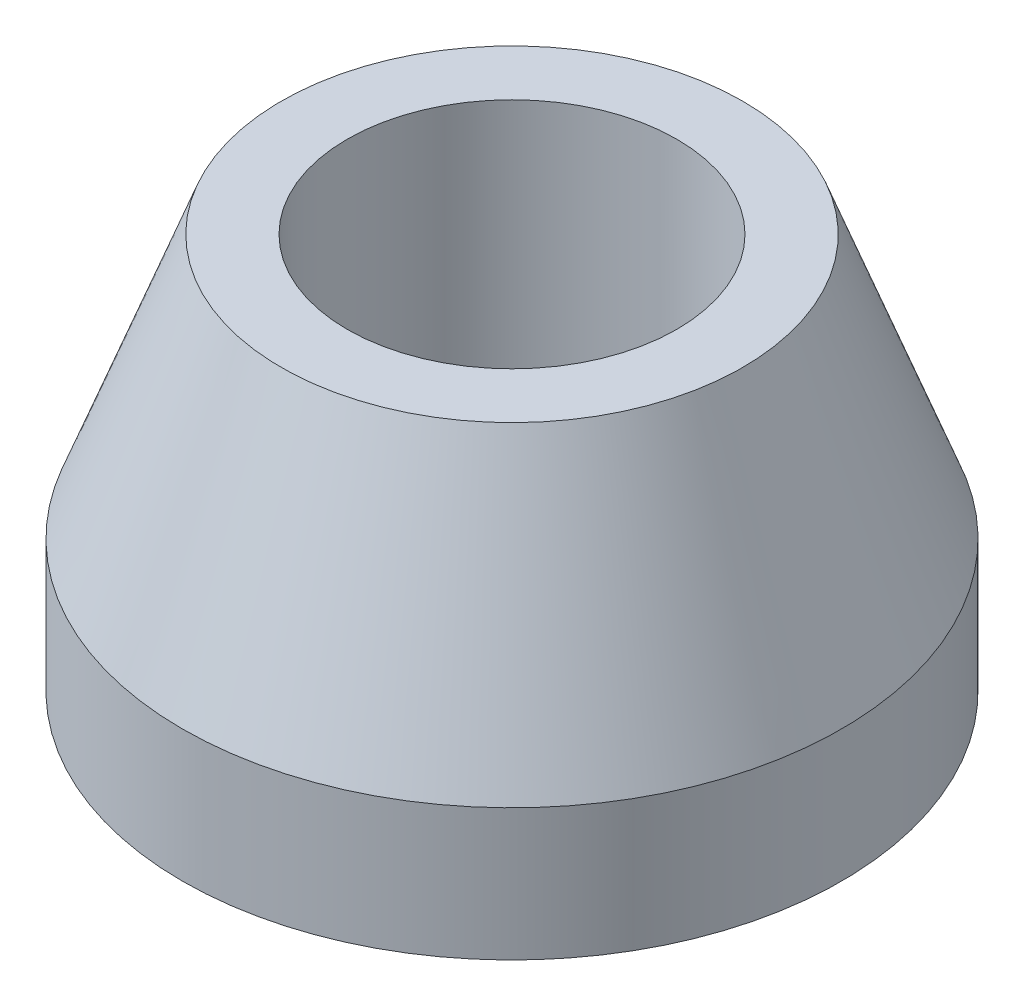
ISO-10303-21;
HEADER;
FILE_DESCRIPTION(('STEP AP214'),'2;1');
FILE_NAME('part.step','',(''),(''),'','','');
FILE_SCHEMA(('AUTOMOTIVE_DESIGN { 1 0 10303 214 1 1 1 1 }'));
ENDSEC;
DATA;
#1=APPLICATION_CONTEXT('core data for automotive mechanical design processes');
#2=APPLICATION_PROTOCOL_DEFINITION('international standard','automotive_design',2000,#1);
#3=PRODUCT_CONTEXT('',#1,'mechanical');
#4=PRODUCT('Part','Part','',(#3));
#5=PRODUCT_RELATED_PRODUCT_CATEGORY('part','',(#4));
#6=PRODUCT_DEFINITION_FORMATION('','',#4);
#7=PRODUCT_DEFINITION_CONTEXT('part definition',#1,'design');
#8=PRODUCT_DEFINITION('design','',#6,#7);
#9=PRODUCT_DEFINITION_SHAPE('','',#8);
#10=(LENGTH_UNIT() NAMED_UNIT(*) SI_UNIT(.MILLI.,.METRE.));
#11=(NAMED_UNIT(*) PLANE_ANGLE_UNIT() SI_UNIT($,.RADIAN.));
#12=(NAMED_UNIT(*) SI_UNIT($,.STERADIAN.) SOLID_ANGLE_UNIT());
#13=UNCERTAINTY_MEASURE_WITH_UNIT(LENGTH_MEASURE(1.E-05),#10,'distance_accuracy_value','');
#14=(GEOMETRIC_REPRESENTATION_CONTEXT(3) GLOBAL_UNCERTAINTY_ASSIGNED_CONTEXT((#13)) GLOBAL_UNIT_ASSIGNED_CONTEXT((#10,
#11,#12)) REPRESENTATION_CONTEXT('',''));
#15=CARTESIAN_POINT('',(0.,0.,0.));
#16=DIRECTION('',(0.,0.,1.));
#17=DIRECTION('',(1.,0.,0.));
#18=AXIS2_PLACEMENT_3D('',#15,#16,#17);
#19=CARTESIAN_POINT('',(0.,0.,0.));
#20=DIRECTION('',(0.,-1.,0.));
#21=DIRECTION('',(0.,0.,-1.));
#22=AXIS2_PLACEMENT_3D('',#19,#20,#21);
#23=CYLINDRICAL_SURFACE('',#22,25.);
#24=CARTESIAN_POINT('',(0.,15.,-25.));
#25=CARTESIAN_POINT('',(-0.138987493787324,15.0000027694463,-25.0000014065203));
#26=CARTESIAN_POINT('',(-0.277940302046088,14.9942032492811,-24.9988389427216));
#27=CARTESIAN_POINT('',(-0.554886864496204,14.9710563512974,-24.994224565157));
#28=CARTESIAN_POINT('',(-0.692880432791919,14.9537067948975,-24.9907722194715));
#29=CARTESIAN_POINT('',(-0.966937148503881,14.9075814377122,-24.981670242636));
#30=CARTESIAN_POINT('',(-1.10299928122357,14.8787998455141,-24.9760194978176));
#31=CARTESIAN_POINT('',(-1.37221108352448,14.810025349109,-24.9626762565998));
#32=CARTESIAN_POINT('',(-1.50535966309261,14.7700283237777,-24.9549830097359));
#33=CARTESIAN_POINT('',(-1.76758319373794,14.6791962522582,-24.9377804442932));
#34=CARTESIAN_POINT('',(-1.896663374225,14.6283758297848,-24.9282735779222));
#35=CARTESIAN_POINT('',(-2.15009997814349,14.5162240178123,-24.9076944208426));
#36=CARTESIAN_POINT('',(-2.2744546389337,14.4548887523412,-24.8966215531404));
#37=CARTESIAN_POINT('',(-2.51749782000809,14.3221945692906,-24.8732206370355));
#38=CARTESIAN_POINT('',(-2.63618884664851,14.2508401417061,-24.8608931515555));
#39=CARTESIAN_POINT('',(-2.86722020463685,14.0985603647523,-24.8353088041128));
#40=CARTESIAN_POINT('',(-2.97955814193969,14.0176314424647,-24.8220515959613));
#41=CARTESIAN_POINT('',(-3.1983785388143,13.8457711931702,-24.7948114657324));
#42=CARTESIAN_POINT('',(-3.30477652475172,13.7547333566458,-24.780821838943));
#43=CARTESIAN_POINT('',(-3.50958996762926,13.5640376679645,-24.7526457290753));
#44=CARTESIAN_POINT('',(-3.60800245195942,13.4643766340819,-24.738459174971));
#45=CARTESIAN_POINT('',(-3.79610927604841,13.2571655640739,-24.7102933832022));
#46=CARTESIAN_POINT('',(-3.88580612172819,13.1496178112366,-24.6963140869323));
#47=CARTESIAN_POINT('',(-4.05592901668139,12.9272928345424,-24.6689453876666));
#48=CARTESIAN_POINT('',(-4.13635163435981,12.8125129588355,-24.6555562041458));
#49=CARTESIAN_POINT('',(-4.28798741229219,12.5754841568505,-24.6296394657581));
#50=CARTESIAN_POINT('',(-4.35911381454495,12.4531786550123,-24.6171204770982));
#51=CARTESIAN_POINT('',(-4.49081269831453,12.2028712528765,-24.5934353082732));
#52=CARTESIAN_POINT('',(-4.55138122040544,12.0748672380124,-24.5822696361062));
#53=CARTESIAN_POINT('',(-4.71644727257975,11.6837416438572,-24.5513304070068));
#54=CARTESIAN_POINT('',(-4.8044888260482,11.4132193246056,-24.5340820165952));
#55=CARTESIAN_POINT('',(-4.93264780265691,10.8645385652061,-24.508635793463));
#56=CARTESIAN_POINT('',(-4.97337819482265,10.5865266702931,-24.5003223072134));
#57=CARTESIAN_POINT('',(-5.00775493418216,10.027461501124,-24.4933199482487));
#58=CARTESIAN_POINT('',(-5.00140609582258,9.74640854079041,-24.4946300913956));
#59=CARTESIAN_POINT('',(-4.94227436036826,9.19376328007145,-24.5066272442008));
#60=CARTESIAN_POINT('',(-4.89019310186595,8.92209222682575,-24.5171725589932));
#61=CARTESIAN_POINT('',(-4.7421890224497,8.39142036175825,-24.546227391949));
#62=CARTESIAN_POINT('',(-4.64626410780486,8.13242015568011,-24.5647372904543));
#63=CARTESIAN_POINT('',(-4.41262402680007,7.63242348985321,-24.6077809023025));
#64=CARTESIAN_POINT('',(-4.27463078523214,7.39156054809247,-24.632354484594));
#65=CARTESIAN_POINT('',(-3.96096784378848,6.93614580420382,-24.684730944745));
#66=CARTESIAN_POINT('',(-3.78529381392922,6.72159703035303,-24.7125341935642));
#67=CARTESIAN_POINT('',(-3.39749968079915,6.32085297284371,-24.7688510603976));
#68=CARTESIAN_POINT('',(-3.18478080820446,6.13523715671345,-24.797368460096));
#69=CARTESIAN_POINT('',(-2.73092511816779,5.80223077248482,-24.8514424361697));
#70=CARTESIAN_POINT('',(-2.48978793632426,5.654840694624,-24.8769989745701));
#71=CARTESIAN_POINT('',(-1.98529693496818,5.40236245277653,-24.9223345079227));
#72=CARTESIAN_POINT('',(-1.72190909807365,5.29734053140293,-24.9421044423773));
#73=CARTESIAN_POINT('',(-1.1807448820962,5.13319763018151,-24.9735704494292));
#74=CARTESIAN_POINT('',(-0.902970250347201,5.07407109003581,-24.98526750005));
#75=CARTESIAN_POINT('',(-0.345897028150551,5.00421773063142,-24.9991335933204));
#76=CARTESIAN_POINT('',(-0.0667016415443251,4.9926979010851,-25.0014587325673));
#77=CARTESIAN_POINT('',(0.489624670880015,5.01624929592439,-24.9967525965614));
#78=CARTESIAN_POINT('',(0.766755711869965,5.05131790121963,-24.9897218472742));
#79=CARTESIAN_POINT('',(1.30852830007856,5.1663918633032,-24.9671916002008));
#80=CARTESIAN_POINT('',(1.57325974299468,5.24599032609437,-24.9517688194687));
#81=CARTESIAN_POINT('',(2.08561813620307,5.44741992967542,-24.9141776037933));
#82=CARTESIAN_POINT('',(2.33324380335236,5.56925423455486,-24.892008663478));
#83=CARTESIAN_POINT('',(2.80770587332562,5.85341239133697,-24.8429955738642));
#84=CARTESIAN_POINT('',(3.03425065213174,6.01621367280056,-24.8160975113418));
#85=CARTESIAN_POINT('',(3.45709007722326,6.3770461884555,-24.760736752006));
#86=CARTESIAN_POINT('',(3.65338147605435,6.57508119979268,-24.7322738876682));
#87=CARTESIAN_POINT('',(4.01320302351496,7.0043658784477,-24.6764651380018));
#88=CARTESIAN_POINT('',(4.17618877400404,7.23607540979487,-24.6491428619003));
#89=CARTESIAN_POINT('',(4.46092683850573,7.7240601179627,-24.5992097395686));
#90=CARTESIAN_POINT('',(4.58268080227279,7.98033431138257,-24.5765987048474));
#91=CARTESIAN_POINT('',(4.78076018011429,8.50882893225384,-24.5388364729789));
#92=CARTESIAN_POINT('',(4.85732111853824,8.78095841785706,-24.5236466726876));
#93=CARTESIAN_POINT('',(4.96353963899985,9.33471304958447,-24.5023739077135));
#94=CARTESIAN_POINT('',(4.9932033375265,9.61633695252213,-24.4962897554484));
#95=CARTESIAN_POINT('',(5.00179339144585,10.0366703889551,-24.4945288792509));
#96=CARTESIAN_POINT('',(4.99885021968412,10.1752265681492,-24.4951330184965));
#97=CARTESIAN_POINT('',(4.98148651470878,10.4515737957145,-24.4986714739674));
#98=CARTESIAN_POINT('',(4.9670703371849,10.5893651144752,-24.5016049058833));
#99=CARTESIAN_POINT('',(4.92686276339316,10.8632490159191,-24.5097212135577));
#100=CARTESIAN_POINT('',(4.90106738632089,10.9993409869687,-24.5149048765081));
#101=CARTESIAN_POINT('',(4.83831799577184,11.2687799057397,-24.5273664043086));
#102=CARTESIAN_POINT('',(4.80136796328246,11.4021278146839,-24.5346435219816));
#103=CARTESIAN_POINT('',(4.71667811844351,11.6649227005665,-24.5510651803018));
#104=CARTESIAN_POINT('',(4.66896100938054,11.7943772453011,-24.5602057877658));
#105=CARTESIAN_POINT('',(4.56306801677477,12.0487516964052,-24.5800998692381));
#106=CARTESIAN_POINT('',(4.5048958336854,12.1736731884551,-24.5908527723703));
#107=CARTESIAN_POINT('',(4.37847423732261,12.4182475627271,-24.6136768592635));
#108=CARTESIAN_POINT('',(4.31022064232977,12.537898231772,-24.6257485895239));
#109=CARTESIAN_POINT('',(4.1641570153785,12.7710492454946,-24.6508678052533));
#110=CARTESIAN_POINT('',(4.08635026305034,12.8845516817026,-24.6639149552593));
#111=CARTESIAN_POINT('',(3.92025868558202,13.1066267352987,-24.6908640955351));
#112=CARTESIAN_POINT('',(3.83181538764857,13.2150795397072,-24.7047769949563));
#113=CARTESIAN_POINT('',(3.64620484015059,13.424138296357,-24.7328525343466));
#114=CARTESIAN_POINT('',(3.54904066604526,13.5247469916541,-24.7470150848702));
#115=CARTESIAN_POINT('',(3.34655721556743,13.717540620803,-24.7752095204235));
#116=CARTESIAN_POINT('',(3.24123314471885,13.8097205317761,-24.7892413231228));
#117=CARTESIAN_POINT('',(3.02322778921367,13.9849269400267,-24.8167717117019));
#118=CARTESIAN_POINT('',(2.91054922625043,14.067956793247,-24.8302704919035));
#119=CARTESIAN_POINT('',(2.67729343786965,14.2251738971151,-24.8565085935593));
#120=CARTESIAN_POINT('',(2.55664367436167,14.2992552310598,-24.869238066002));
#121=CARTESIAN_POINT('',(2.30944481023434,14.4369443352167,-24.8934104051449));
#122=CARTESIAN_POINT('',(2.18289789785573,14.5005559513136,-24.9048537437938));
#123=CARTESIAN_POINT('',(1.92482332637311,14.6168245035003,-24.9261268452451));
#124=CARTESIAN_POINT('',(1.79329873940675,14.6694880703005,-24.9359575839567));
#125=CARTESIAN_POINT('',(1.52618442476761,14.763487680713,-24.9537310452209));
#126=CARTESIAN_POINT('',(1.39059548585458,14.8048259066209,-24.9616741314688));
#127=CARTESIAN_POINT('',(1.04920215690347,14.8932231271974,-24.9788087281562));
#128=CARTESIAN_POINT('',(0.841457494405879,14.9332098107155,-24.9867141903289));
#129=CARTESIAN_POINT('',(0.422448453280691,14.9865957194188,-24.9973086745575));
#130=CARTESIAN_POINT('',(0.211184187046265,14.9999957919719,-24.9999978628663));
#131=CARTESIAN_POINT('',(0.,15.,-25.));
#132=B_SPLINE_CURVE_WITH_KNOTS('',3,(#24,#25,#26,#27,#28,#29,#30,#31,#32,#33,#34,#35,#36,#37,
#38,#39,#40,#41,#42,#43,#44,#45,#46,#47,#48,#49,#50,#51,#52,#53,#54,#55,#56,#57,#58,#59,#60,#61,
#62,#63,#64,#65,#66,#67,#68,#69,#70,#71,#72,#73,#74,#75,#76,#77,#78,#79,#80,#81,#82,#83,#84,#85,
#86,#87,#88,#89,#90,#91,#92,#93,#94,#95,#96,#97,#98,#99,#100,#101,#102,#103,#104,#105,#106,#107,
#108,#109,#110,#111,#112,#113,#114,#115,#116,#117,#118,#119,#120,#121,#122,#123,#124,#125,#126,
#127,#128,#129,#130,#131),.UNSPECIFIED.,.T.,.F.,(4,2,2,2,2,2,2,2,2,2,2,2,2,2,2,2,2,2,2,2,2,2,2,
2,2,2,2,2,2,2,2,2,2,2,2,2,2,2,2,2,2,2,2,2,2,2,2,2,2,2,2,2,2,4),(0.,0.416777047445418,
0.833632730149863,1.25069985977206,1.66792044248879,2.0845808461562,2.50139517036217,
2.91802329572164,3.33480738770838,3.7564966440872,4.17834216132243,4.60006602836891,
5.02194544187045,5.44751701120412,5.87324783701269,6.72369555497643,7.56299734191929,
8.40221330082507,9.22877443707773,10.0553750494503,10.8875625969434,11.7198458242473,
12.5671007113313,13.4143664637548,14.262951829465,15.1114343716656,15.9457248705771,
16.7799684696572,17.6067107843,18.4335150475649,19.2704413884317,20.1074575040603,
20.9572195157251,21.8069475229371,22.6522071384191,23.4973565033242,23.9127168808878,
24.3279196434016,24.7432677723233,25.1584678424529,25.5728004765726,25.9869867501795,
26.4013453111814,26.8155620171985,27.2369706991647,27.6582313488923,28.0797414220244,
28.5010963808509,28.9270309561325,29.3528087202144,29.7783278548953,30.203764937947,
30.8370559265658,31.4703267306209),.UNSPECIFIED.);
#133=CARTESIAN_POINT('',(0.,15.,-25.));
#134=VERTEX_POINT('',#133);
#135=EDGE_CURVE('E61',#134,#134,#132,.T.);
#136=ORIENTED_EDGE('',*,*,#135,.F.);
#137=EDGE_LOOP('',(#136));
#138=FACE_BOUND('',#137,.T.);
#139=CARTESIAN_POINT('',(0.,0.,0.));
#140=DIRECTION('',(0.,-1.,0.));
#141=DIRECTION('',(0.,0.,-1.));
#142=AXIS2_PLACEMENT_3D('',#139,#140,#141);
#143=CIRCLE('',#142,25.);
#144=CARTESIAN_POINT('',(0.,0.,-25.));
#145=VERTEX_POINT('',#144);
#146=EDGE_CURVE('E42',#145,#145,#143,.T.);
#147=ORIENTED_EDGE('',*,*,#146,.T.);
#148=EDGE_LOOP('',(#147));
#149=FACE_BOUND('',#148,.T.);
#150=CARTESIAN_POINT('',(0.,60.,0.));
#151=DIRECTION('',(0.,-1.,0.));
#152=DIRECTION('',(0.,0.,-1.));
#153=AXIS2_PLACEMENT_3D('',#150,#151,#152);
#154=CIRCLE('',#153,25.);
#155=CARTESIAN_POINT('',(0.,60.,-25.));
#156=VERTEX_POINT('',#155);
#157=EDGE_CURVE('E58',#156,#156,#154,.T.);
#158=ORIENTED_EDGE('',*,*,#157,.F.);
#159=EDGE_LOOP('',(#158));
#160=FACE_BOUND('',#159,.T.);
#161=ADVANCED_FACE('F31',(#138,#149,#160),#23,.F.);
#162=CARTESIAN_POINT('',(25.,0.,0.));
#163=DIRECTION('',(0.,-1.,0.));
#164=DIRECTION('',(0.,0.,-1.));
#165=AXIS2_PLACEMENT_3D('',#162,#163,#164);
#166=PLANE('',#165);
#167=CARTESIAN_POINT('',(0.,0.,0.));
#168=DIRECTION('',(0.,-1.,0.));
#169=DIRECTION('',(0.,0.,-1.));
#170=AXIS2_PLACEMENT_3D('',#167,#168,#169);
#171=CIRCLE('',#170,50.);
#172=CARTESIAN_POINT('',(0.,0.,-50.));
#173=VERTEX_POINT('',#172);
#174=EDGE_CURVE('E46',#173,#173,#171,.T.);
#175=ORIENTED_EDGE('',*,*,#174,.T.);
#176=EDGE_LOOP('',(#175));
#177=FACE_BOUND('',#176,.T.);
#178=ORIENTED_EDGE('',*,*,#146,.F.);
#179=EDGE_LOOP('',(#178));
#180=FACE_BOUND('',#179,.T.);
#181=ADVANCED_FACE('F81',(#177,#180),#166,.T.);
#182=CARTESIAN_POINT('',(0.,0.,0.));
#183=DIRECTION('',(0.,-1.,0.));
#184=DIRECTION('',(0.,0.,-1.));
#185=AXIS2_PLACEMENT_3D('',#182,#183,#184);
#186=CYLINDRICAL_SURFACE('',#185,50.);
#187=CARTESIAN_POINT('',(0.,15.,-50.));
#188=CARTESIAN_POINT('',(0.140100461033938,15.0000013777548,-50.0000003743881));
#189=CARTESIAN_POINT('',(0.280179892133932,14.9941093369416,-49.9994099664565));
#190=CARTESIAN_POINT('',(0.559384605481633,14.9705849108721,-49.9970656286844));
#191=CARTESIAN_POINT('',(0.698509650807407,14.9529497099087,-49.9953114197949));
#192=CARTESIAN_POINT('',(0.974876810291467,14.9060450546854,-49.990686488879));
#193=CARTESIAN_POINT('',(1.11211733275272,14.8767663246402,-49.9878148767159));
#194=CARTESIAN_POINT('',(1.38367953746195,14.806776311435,-49.9810352616415));
#195=CARTESIAN_POINT('',(1.51800013207783,14.7660608442832,-49.9771268794695));
#196=CARTESIAN_POINT('',(1.78258815793808,14.673542799818,-49.968388862618));
#197=CARTESIAN_POINT('',(1.9128594168042,14.6217510813806,-49.9635601307267));
#198=CARTESIAN_POINT('',(2.16861600653063,14.5074087031425,-49.9531129442553));
#199=CARTESIAN_POINT('',(2.29409955432331,14.4448540818326,-49.9474941990341));
#200=CARTESIAN_POINT('',(2.53927920710544,14.3094848283795,-49.9356297496778));
#201=CARTESIAN_POINT('',(2.65897858413043,14.2366760903252,-49.9293844063018));
#202=CARTESIAN_POINT('',(2.89187409366608,14.0812584220491,-49.9164369111371));
#203=CARTESIAN_POINT('',(3.00506780046608,13.9986458711058,-49.90973459097));
#204=CARTESIAN_POINT('',(3.22442516584175,13.8239762941015,-49.8960438865044));
#205=CARTESIAN_POINT('',(3.33056800916345,13.7318931858257,-49.8890547458808));
#206=CARTESIAN_POINT('',(3.53476522468386,13.5390902133424,-49.8750029081307));
#207=CARTESIAN_POINT('',(3.6328165925971,13.4383671692677,-49.8679401847701));
#208=CARTESIAN_POINT('',(3.82006793418719,13.22905453875,-49.853945639318));
#209=CARTESIAN_POINT('',(3.90927074723064,13.1204674952211,-49.8470137758174));
#210=CARTESIAN_POINT('',(4.07826305039188,12.8961182338074,-49.8334722976176));
#211=CARTESIAN_POINT('',(4.15804905479459,12.7803533830289,-49.8268628027738));
#212=CARTESIAN_POINT('',(4.30773494085765,12.5422870703204,-49.8141453282559));
#213=CARTESIAN_POINT('',(4.37761719102717,12.4199744717299,-49.8080382509359));
#214=CARTESIAN_POINT('',(4.50685113325592,12.1698210139221,-49.796510955401));
#215=CARTESIAN_POINT('',(4.56619891513861,12.0419781237819,-49.7910909924413));
#216=CARTESIAN_POINT('',(4.67388203969832,11.781750940842,-49.7810984182545));
#217=CARTESIAN_POINT('',(4.72222165895323,11.6493684347209,-49.7765254780955));
#218=CARTESIAN_POINT('',(4.80757979958036,11.3809589711489,-49.7683532658288));
#219=CARTESIAN_POINT('',(4.84459415265808,11.2449306918469,-49.7647543522704));
#220=CARTESIAN_POINT('',(4.93794230581997,10.8338494730534,-49.7556112743006));
#221=CARTESIAN_POINT('',(4.97706409180383,10.5546295739826,-49.7516744142284));
#222=CARTESIAN_POINT('',(5.00789059851941,9.99371322589344,-49.7485802587524));
#223=CARTESIAN_POINT('',(4.9995965655709,9.71201684216349,-49.7494228377215));
#224=CARTESIAN_POINT('',(4.93601762379308,9.15503476757941,-49.7557708498252));
#225=CARTESIAN_POINT('',(4.88090320838524,8.8797295356838,-49.7612593648233));
#226=CARTESIAN_POINT('',(4.72549673300413,8.34230715162628,-49.7762565790783));
#227=CARTESIAN_POINT('',(4.62520406273851,8.08019017767169,-49.7857653326426));
#228=CARTESIAN_POINT('',(4.3821041974626,7.57603287816206,-49.8077505089504));
#229=CARTESIAN_POINT('',(4.23922134072076,7.33402927087453,-49.8202322051485));
#230=CARTESIAN_POINT('',(3.91505020964741,6.87737370711309,-49.846752576903));
#231=CARTESIAN_POINT('',(3.73376081125102,6.6627225514726,-49.8607912980239));
#232=CARTESIAN_POINT('',(3.33697054240559,6.26587308893184,-49.8889192682764));
#233=CARTESIAN_POINT('',(3.12132238898974,6.08382200636641,-49.9030084673536));
#234=CARTESIAN_POINT('',(2.66244741395265,5.7584818196776,-49.9295914532222));
#235=CARTESIAN_POINT('',(2.41922056141156,5.61519275901287,-49.9420852382248));
#236=CARTESIAN_POINT('',(1.91199052704802,5.37144990265422,-49.9640737835429));
#237=CARTESIAN_POINT('',(1.64798373156272,5.27100357695714,-49.9735680207869));
#238=CARTESIAN_POINT('',(1.10673608703644,5.11590541539382,-49.988482372022));
#239=CARTESIAN_POINT('',(0.829495634016396,5.0612522100625,-49.9939026078476));
#240=CARTESIAN_POINT('',(0.270925495326696,4.99947846131062,-50.0000425834211));
#241=CARTESIAN_POINT('',(-0.0103815106741396,4.992154757637,-50.000782413361));
#242=CARTESIAN_POINT('',(-0.570218966431821,5.02471431634431,-49.9975320878656));
#243=CARTESIAN_POINT('',(-0.848749453648462,5.06459694096279,-49.993541996332));
#244=CARTESIAN_POINT('',(-1.39454103462632,5.19026847273057,-49.9812930768513));
#245=CARTESIAN_POINT('',(-1.66182424652395,5.27596225599486,-49.9730430954945));
#246=CARTESIAN_POINT('',(-2.17822160525502,5.49072588658192,-49.953199943438));
#247=CARTESIAN_POINT('',(-2.42733534458293,5.61979670640248,-49.9416066977843));
#248=CARTESIAN_POINT('',(-2.90124090708419,5.91815413190872,-49.9163237649944));
#249=CARTESIAN_POINT('',(-3.12594832200516,6.0875742150794,-49.9026271744651));
#250=CARTESIAN_POINT('',(-3.54380809329823,6.46163056826009,-49.8746966491831));
#251=CARTESIAN_POINT('',(-3.73695965742386,6.66626772217099,-49.8604627009505));
#252=CARTESIAN_POINT('',(-4.08693063657039,7.10583201339029,-49.8330011856591));
#253=CARTESIAN_POINT('',(-4.2436167191349,7.34086556811305,-49.8197774270285));
#254=CARTESIAN_POINT('',(-4.51529096798641,7.83404001528952,-49.7958917029636));
#255=CARTESIAN_POINT('',(-4.63027970447967,8.09218059169726,-49.7852297024982));
#256=CARTESIAN_POINT('',(-4.81507725706781,8.62373172023514,-49.7676970839323));
#257=CARTESIAN_POINT('',(-4.88496539977526,8.89711453755555,-49.7608198120965));
#258=CARTESIAN_POINT('',(-4.97781551006116,9.45196065142293,-49.7516193745049));
#259=CARTESIAN_POINT('',(-5.00077882348839,9.73342371598593,-49.7492960781367));
#260=CARTESIAN_POINT('',(-4.99958027457783,10.1546072849437,-49.7494127947303));
#261=CARTESIAN_POINT('',(-4.99328044671943,10.2945992511425,-49.7500479099195));
#262=CARTESIAN_POINT('',(-4.96896519008512,10.5735377761229,-49.7524830219634));
#263=CARTESIAN_POINT('',(-4.9509541101499,10.7124847036012,-49.754282586412));
#264=CARTESIAN_POINT('',(-4.9033339265936,10.9883995662872,-49.7589979715237));
#265=CARTESIAN_POINT('',(-4.87372057237539,11.1253667571102,-49.7619142012784));
#266=CARTESIAN_POINT('',(-4.80312740218269,11.3962623358421,-49.7687776142575));
#267=CARTESIAN_POINT('',(-4.7621517427028,11.530191815645,-49.7727244204516));
#268=CARTESIAN_POINT('',(-4.66911475363506,11.7941445506906,-49.7815382320036));
#269=CARTESIAN_POINT('',(-4.6170509625864,11.9241669312689,-49.7864054416556));
#270=CARTESIAN_POINT('',(-4.50223825911722,12.1793150162575,-49.7969192874116));
#271=CARTESIAN_POINT('',(-4.43949325070047,12.3044424892882,-49.8025656385956));
#272=CARTESIAN_POINT('',(-4.30372744333054,12.5490193574775,-49.8144815572328));
#273=CARTESIAN_POINT('',(-4.23070301224569,12.6684667255833,-49.82075134474));
#274=CARTESIAN_POINT('',(-4.07493978433922,12.9007610250116,-49.8337332394463));
#275=CARTESIAN_POINT('',(-3.99220451871275,13.013610333391,-49.8404451854741));
#276=CARTESIAN_POINT('',(-3.81717528907235,13.2324754355085,-49.8541564093712));
#277=CARTESIAN_POINT('',(-3.72483897640454,13.3384572914369,-49.8611568702573));
#278=CARTESIAN_POINT('',(-3.53161206753512,13.5422344070354,-49.8752152226331));
#279=CARTESIAN_POINT('',(-3.43072460522393,13.640032640012,-49.8822730922333));
#280=CARTESIAN_POINT('',(-3.22101009987079,13.8268559636939,-49.8962537831342));
#281=CARTESIAN_POINT('',(-3.11217826461907,13.9158756816291,-49.9031765196754));
#282=CARTESIAN_POINT('',(-2.88743471180054,14.0844145715909,-49.9166844506629));
#283=CARTESIAN_POINT('',(-2.77152562327502,14.1639372394988,-49.9232697688008));
#284=CARTESIAN_POINT('',(-2.53305926558131,14.3131718974376,-49.9359380152465));
#285=CARTESIAN_POINT('',(-2.41048371893776,14.3828548148998,-49.9420194337243));
#286=CARTESIAN_POINT('',(-2.15990777377624,14.511610970374,-49.9534835762051));
#287=CARTESIAN_POINT('',(-2.03190938317773,14.5706880936895,-49.9588665558713));
#288=CARTESIAN_POINT('',(-1.77145809043289,14.67779263983,-49.9687792484329));
#289=CARTESIAN_POINT('',(-1.63900893926476,14.7258291123605,-49.9733096595983));
#290=CARTESIAN_POINT('',(-1.37054695395703,14.8105524510892,-49.9813929477421));
#291=CARTESIAN_POINT('',(-1.23453500404774,14.8472421049759,-49.9849460647987));
#292=CARTESIAN_POINT('',(-0.917364218647633,14.9185766754685,-49.9919068178199));
#293=CARTESIAN_POINT('',(-0.735250267899009,14.9490810689268,-49.9949297207431));
#294=CARTESIAN_POINT('',(-0.368745400564769,14.9897917828617,-49.9989760613865));
#295=CARTESIAN_POINT('',(-0.184354493372664,14.9999981870489,-49.9999995073526));
#296=CARTESIAN_POINT('',(0.,15.,-50.));
#297=B_SPLINE_CURVE_WITH_KNOTS('',3,(#187,#188,#189,#190,#191,#192,#193,#194,#195,#196,#197,
#198,#199,#200,#201,#202,#203,#204,#205,#206,#207,#208,#209,#210,#211,#212,#213,#214,#215,#216,
#217,#218,#219,#220,#221,#222,#223,#224,#225,#226,#227,#228,#229,#230,#231,#232,#233,#234,#235,
#236,#237,#238,#239,#240,#241,#242,#243,#244,#245,#246,#247,#248,#249,#250,#251,#252,#253,#254,
#255,#256,#257,#258,#259,#260,#261,#262,#263,#264,#265,#266,#267,#268,#269,#270,#271,#272,#273,
#274,#275,#276,#277,#278,#279,#280,#281,#282,#283,#284,#285,#286,#287,#288,#289,#290,#291,#292,
#293,#294,#295,#296),.UNSPECIFIED.,.T.,.F.,(4,2,2,2,2,2,2,2,2,2,2,2,2,2,2,2,2,2,2,2,2,2,2,2,2,2,
2,2,2,2,2,2,2,2,2,2,2,2,2,2,2,2,2,2,2,2,2,2,2,2,2,2,2,2,4),(0.,0.420140168309288,
0.840381111696768,1.26095751168313,1.68168797529278,2.10200784094379,2.52248274628059,
2.94271694071896,3.36310682092266,3.78468715311913,4.20642331622124,4.62802370983912,
5.04977967635892,5.47227730157367,5.89493142271309,6.31742106512358,6.74006601944364,
7.58160289957827,8.42311766010726,9.26158116937396,10.1000560054001,10.9400293659632,
11.7800273138747,12.6237280071288,13.467429646307,14.3112783319975,15.1551017810904,
15.9953007277063,16.8354883232756,17.6739380620337,18.5124065997918,19.3536883347534,
20.1949911878299,21.0393234777484,21.8836442210871,22.7264758269686,23.5692832592977,
23.9892798829599,24.4091206346366,24.8291153427782,25.2489566130453,25.6688911814504,
26.0886725912905,26.5086027007735,26.9283805794993,27.3500956078529,27.7716567456625,
28.1934743134009,28.6151361275947,29.0380188241247,29.460746285189,29.883126003011,
30.305401867917,30.8582554897697,31.4111068316036),.UNSPECIFIED.);
#298=CARTESIAN_POINT('',(0.,15.,-50.));
#299=VERTEX_POINT('',#298);
#300=EDGE_CURVE('E10',#299,#299,#297,.T.);
#301=ORIENTED_EDGE('',*,*,#300,.F.);
#302=EDGE_LOOP('',(#301));
#303=FACE_BOUND('',#302,.T.);
#304=CARTESIAN_POINT('',(0.,20.,0.));
#305=DIRECTION('',(0.,-1.,0.));
#306=DIRECTION('',(0.,0.,-1.));
#307=AXIS2_PLACEMENT_3D('',#304,#305,#306);
#308=CIRCLE('',#307,50.);
#309=CARTESIAN_POINT('',(0.,20.,-50.));
#310=VERTEX_POINT('',#309);
#311=EDGE_CURVE('E50',#310,#310,#308,.T.);
#312=ORIENTED_EDGE('',*,*,#311,.T.);
#313=EDGE_LOOP('',(#312));
#314=FACE_BOUND('',#313,.T.);
#315=ORIENTED_EDGE('',*,*,#174,.F.);
#316=EDGE_LOOP('',(#315));
#317=FACE_BOUND('',#316,.T.);
#318=ADVANCED_FACE('F77',(#303,#314,#317),#186,.T.);
#319=CARTESIAN_POINT('',(0.,20.,0.));
#320=DIRECTION('',(0.,-1.,0.));
#321=DIRECTION('',(0.,0.,-1.));
#322=AXIS2_PLACEMENT_3D('',#319,#320,#321);
#323=CONICAL_SURFACE('',#322,50.,0.358770670270572);
#324=CARTESIAN_POINT('',(0.,60.,0.));
#325=DIRECTION('',(0.,-1.,0.));
#326=DIRECTION('',(0.,0.,-1.));
#327=AXIS2_PLACEMENT_3D('',#324,#325,#326);
#328=CIRCLE('',#327,35.);
#329=CARTESIAN_POINT('',(0.,60.,-35.));
#330=VERTEX_POINT('',#329);
#331=EDGE_CURVE('E55',#330,#330,#328,.T.);
#332=ORIENTED_EDGE('',*,*,#331,.T.);
#333=EDGE_LOOP('',(#332));
#334=FACE_BOUND('',#333,.T.);
#335=ORIENTED_EDGE('',*,*,#311,.F.);
#336=EDGE_LOOP('',(#335));
#337=FACE_BOUND('',#336,.T.);
#338=ADVANCED_FACE('F74',(#334,#337),#323,.T.);
#339=CARTESIAN_POINT('',(35.,60.,0.));
#340=DIRECTION('',(0.,1.,0.));
#341=DIRECTION('',(0.,0.,1.));
#342=AXIS2_PLACEMENT_3D('',#339,#340,#341);
#343=PLANE('',#342);
#344=ORIENTED_EDGE('',*,*,#157,.T.);
#345=EDGE_LOOP('',(#344));
#346=FACE_BOUND('',#345,.T.);
#347=ORIENTED_EDGE('',*,*,#331,.F.);
#348=EDGE_LOOP('',(#347));
#349=FACE_BOUND('',#348,.T.);
#350=ADVANCED_FACE('F69',(#346,#349),#343,.T.);
#351=CARTESIAN_POINT('',(0.,10.,-50.));
#352=DIRECTION('',(0.,0.,1.));
#353=DIRECTION('',(1.,0.,0.));
#354=AXIS2_PLACEMENT_3D('',#351,#352,#353);
#355=CYLINDRICAL_SURFACE('',#354,5.);
#356=ORIENTED_EDGE('',*,*,#135,.T.);
#357=EDGE_LOOP('',(#356));
#358=FACE_BOUND('',#357,.T.);
#359=ORIENTED_EDGE('',*,*,#300,.T.);
#360=EDGE_LOOP('',(#359));
#361=FACE_BOUND('',#360,.T.);
#362=ADVANCED_FACE('F65',(#358,#361),#355,.F.);
#363=CLOSED_SHELL('',(#161,#181,#318,#338,#350,#362));
#364=MANIFOLD_SOLID_BREP('B2',#363);
#365=ADVANCED_BREP_SHAPE_REPRESENTATION('',(#18,#364),#14);
#366=SHAPE_DEFINITION_REPRESENTATION(#9,#365);
ENDSEC;
END-ISO-10303-21;
